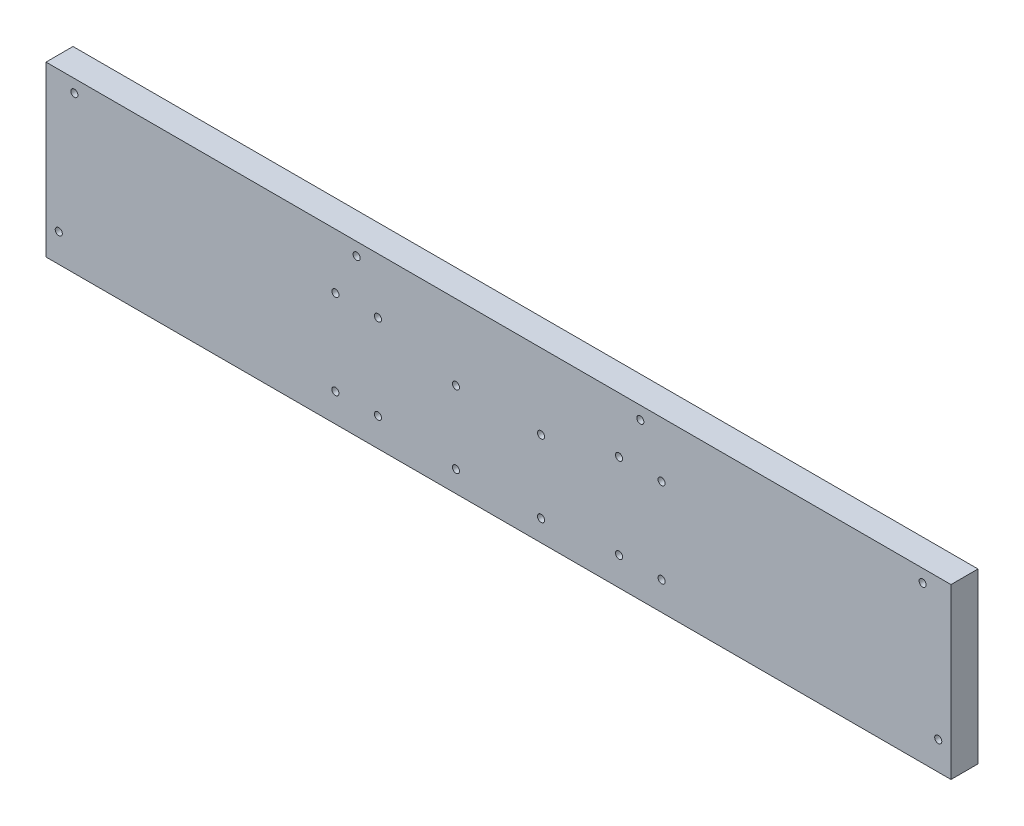
ISO-10303-21;
HEADER;
FILE_DESCRIPTION(('STEP AP214'),'2;1');
FILE_NAME('part.step','',(''),(''),'','','');
FILE_SCHEMA(('AUTOMOTIVE_DESIGN { 1 0 10303 214 1 1 1 1 }'));
ENDSEC;
DATA;
#1=APPLICATION_CONTEXT('core data for automotive mechanical design processes');
#2=APPLICATION_PROTOCOL_DEFINITION('international standard','automotive_design',2000,#1);
#3=PRODUCT_CONTEXT('',#1,'mechanical');
#4=PRODUCT('Part','Part','',(#3));
#5=PRODUCT_RELATED_PRODUCT_CATEGORY('part','',(#4));
#6=PRODUCT_DEFINITION_FORMATION('','',#4);
#7=PRODUCT_DEFINITION_CONTEXT('part definition',#1,'design');
#8=PRODUCT_DEFINITION('design','',#6,#7);
#9=PRODUCT_DEFINITION_SHAPE('','',#8);
#10=(LENGTH_UNIT() NAMED_UNIT(*) SI_UNIT(.MILLI.,.METRE.));
#11=(NAMED_UNIT(*) PLANE_ANGLE_UNIT() SI_UNIT($,.RADIAN.));
#12=(NAMED_UNIT(*) SI_UNIT($,.STERADIAN.) SOLID_ANGLE_UNIT());
#13=UNCERTAINTY_MEASURE_WITH_UNIT(LENGTH_MEASURE(1.E-05),#10,'distance_accuracy_value','');
#14=(GEOMETRIC_REPRESENTATION_CONTEXT(3) GLOBAL_UNCERTAINTY_ASSIGNED_CONTEXT((#13)) GLOBAL_UNIT_ASSIGNED_CONTEXT((#10,
#11,#12)) REPRESENTATION_CONTEXT('',''));
#15=CARTESIAN_POINT('',(0.,0.,0.));
#16=DIRECTION('',(0.,0.,1.));
#17=DIRECTION('',(1.,0.,0.));
#18=AXIS2_PLACEMENT_3D('',#15,#16,#17);
#19=CARTESIAN_POINT('',(0.,119.05,19.05));
#20=DIRECTION('',(-1.,0.,0.));
#21=DIRECTION('',(0.,0.,1.));
#22=AXIS2_PLACEMENT_3D('',#19,#20,#21);
#23=PLANE('',#22);
#24=DIRECTION('',(0.,1.,0.));
#25=VECTOR('',#24,1.);
#26=CARTESIAN_POINT('',(0.,119.05,0.));
#27=LINE('',#26,#25);
#28=CARTESIAN_POINT('',(0.,0.,0.));
#29=VERTEX_POINT('',#28);
#30=CARTESIAN_POINT('',(0.,119.05,0.));
#31=VERTEX_POINT('',#30);
#32=EDGE_CURVE('E98',#29,#31,#27,.T.);
#33=ORIENTED_EDGE('',*,*,#32,.T.);
#34=DIRECTION('',(0.,0.,-1.));
#35=VECTOR('',#34,1.);
#36=CARTESIAN_POINT('',(0.,119.05,19.05));
#37=LINE('',#36,#35);
#38=CARTESIAN_POINT('',(0.,119.05,19.05));
#39=VERTEX_POINT('',#38);
#40=EDGE_CURVE('E11',#39,#31,#37,.T.);
#41=ORIENTED_EDGE('',*,*,#40,.F.);
#42=DIRECTION('',(0.,1.,0.));
#43=VECTOR('',#42,1.);
#44=CARTESIAN_POINT('',(0.,119.05,19.05));
#45=LINE('',#44,#43);
#46=CARTESIAN_POINT('',(0.,0.,19.05));
#47=VERTEX_POINT('',#46);
#48=EDGE_CURVE('E85',#47,#39,#45,.T.);
#49=ORIENTED_EDGE('',*,*,#48,.F.);
#50=DIRECTION('',(0.,0.,-1.));
#51=VECTOR('',#50,1.);
#52=CARTESIAN_POINT('',(0.,0.,19.05));
#53=LINE('',#52,#51);
#54=EDGE_CURVE('E94',#47,#29,#53,.T.);
#55=ORIENTED_EDGE('',*,*,#54,.T.);
#56=EDGE_LOOP('',(#33,#41,#49,#55));
#57=FACE_BOUND('',#56,.T.);
#58=ADVANCED_FACE('F32',(#57),#23,.F.);
#59=CARTESIAN_POINT('',(0.,119.05,19.05));
#60=DIRECTION('',(0.,-1.,0.));
#61=DIRECTION('',(0.,0.,-1.));
#62=AXIS2_PLACEMENT_3D('',#59,#60,#61);
#63=PLANE('',#62);
#64=DIRECTION('',(-1.,0.,0.));
#65=VECTOR('',#64,1.);
#66=CARTESIAN_POINT('',(0.,119.05,0.));
#67=LINE('',#66,#65);
#68=CARTESIAN_POINT('',(-638.1,119.05,0.));
#69=VERTEX_POINT('',#68);
#70=EDGE_CURVE('E89',#31,#69,#67,.T.);
#71=ORIENTED_EDGE('',*,*,#70,.T.);
#72=DIRECTION('',(0.,0.,-1.));
#73=VECTOR('',#72,1.);
#74=CARTESIAN_POINT('',(-638.1,119.05,19.05));
#75=LINE('',#74,#73);
#76=CARTESIAN_POINT('',(-638.1,119.05,19.05));
#77=VERTEX_POINT('',#76);
#78=EDGE_CURVE('E41',#77,#69,#75,.T.);
#79=ORIENTED_EDGE('',*,*,#78,.F.);
#80=DIRECTION('',(-1.,0.,0.));
#81=VECTOR('',#80,1.);
#82=CARTESIAN_POINT('',(0.,119.05,19.05));
#83=LINE('',#82,#81);
#84=EDGE_CURVE('E80',#39,#77,#83,.T.);
#85=ORIENTED_EDGE('',*,*,#84,.F.);
#86=ORIENTED_EDGE('',*,*,#40,.T.);
#87=EDGE_LOOP('',(#71,#79,#85,#86));
#88=FACE_BOUND('',#87,.T.);
#89=ADVANCED_FACE('F88',(#88),#63,.F.);
#90=CARTESIAN_POINT('',(-638.1,119.05,19.05));
#91=DIRECTION('',(1.,0.,0.));
#92=DIRECTION('',(0.,0.,-1.));
#93=AXIS2_PLACEMENT_3D('',#90,#91,#92);
#94=PLANE('',#93);
#95=DIRECTION('',(0.,-1.,0.));
#96=VECTOR('',#95,1.);
#97=CARTESIAN_POINT('',(-638.1,119.05,0.));
#98=LINE('',#97,#96);
#99=CARTESIAN_POINT('',(-638.1,0.,0.));
#100=VERTEX_POINT('',#99);
#101=EDGE_CURVE('E67',#69,#100,#98,.T.);
#102=ORIENTED_EDGE('',*,*,#101,.T.);
#103=DIRECTION('',(0.,0.,-1.));
#104=VECTOR('',#103,1.);
#105=CARTESIAN_POINT('',(-638.1,0.,19.05));
#106=LINE('',#105,#104);
#107=CARTESIAN_POINT('',(-638.1,0.,19.05));
#108=VERTEX_POINT('',#107);
#109=EDGE_CURVE('E90',#108,#100,#106,.T.);
#110=ORIENTED_EDGE('',*,*,#109,.F.);
#111=DIRECTION('',(0.,-1.,0.));
#112=VECTOR('',#111,1.);
#113=CARTESIAN_POINT('',(-638.1,119.05,19.05));
#114=LINE('',#113,#112);
#115=EDGE_CURVE('E83',#77,#108,#114,.T.);
#116=ORIENTED_EDGE('',*,*,#115,.F.);
#117=ORIENTED_EDGE('',*,*,#78,.T.);
#118=EDGE_LOOP('',(#102,#110,#116,#117));
#119=FACE_BOUND('',#118,.T.);
#120=ADVANCED_FACE('F92',(#119),#94,.F.);
#121=CARTESIAN_POINT('',(0.,0.,19.05));
#122=DIRECTION('',(0.,1.,0.));
#123=DIRECTION('',(0.,0.,1.));
#124=AXIS2_PLACEMENT_3D('',#121,#122,#123);
#125=PLANE('',#124);
#126=DIRECTION('',(1.,0.,0.));
#127=VECTOR('',#126,1.);
#128=CARTESIAN_POINT('',(0.,0.,0.));
#129=LINE('',#128,#127);
#130=EDGE_CURVE('E73',#100,#29,#129,.T.);
#131=ORIENTED_EDGE('',*,*,#130,.T.);
#132=ORIENTED_EDGE('',*,*,#54,.F.);
#133=DIRECTION('',(1.,0.,0.));
#134=VECTOR('',#133,1.);
#135=CARTESIAN_POINT('',(0.,0.,19.05));
#136=LINE('',#135,#134);
#137=EDGE_CURVE('E50',#108,#47,#136,.T.);
#138=ORIENTED_EDGE('',*,*,#137,.F.);
#139=ORIENTED_EDGE('',*,*,#109,.T.);
#140=EDGE_LOOP('',(#131,#132,#138,#139));
#141=FACE_BOUND('',#140,.T.);
#142=ADVANCED_FACE('F188',(#141),#125,.F.);
#143=CARTESIAN_POINT('',(0.,0.,19.05));
#144=DIRECTION('',(0.,0.,-1.));
#145=DIRECTION('',(-1.,0.,0.));
#146=AXIS2_PLACEMENT_3D('',#143,#144,#145);
#147=PLANE('',#146);
#148=CARTESIAN_POINT('',(-434.05,20.,19.05));
#149=DIRECTION('',(0.,0.,-1.));
#150=DIRECTION('',(-1.,0.,0.));
#151=AXIS2_PLACEMENT_3D('',#148,#149,#150);
#152=CIRCLE('',#151,2.5);
#153=CARTESIAN_POINT('',(-436.55,20.,19.05));
#154=VERTEX_POINT('',#153);
#155=EDGE_CURVE('E400',#154,#154,#152,.T.);
#156=ORIENTED_EDGE('',*,*,#155,.T.);
#157=EDGE_LOOP('',(#156));
#158=FACE_BOUND('',#157,.T.);
#159=CARTESIAN_POINT('',(-404.05,20.,19.05));
#160=DIRECTION('',(0.,0.,-1.));
#161=DIRECTION('',(-1.,0.,0.));
#162=AXIS2_PLACEMENT_3D('',#159,#160,#161);
#163=CIRCLE('',#162,2.5);
#164=CARTESIAN_POINT('',(-406.55,20.,19.05));
#165=VERTEX_POINT('',#164);
#166=EDGE_CURVE('E404',#165,#165,#163,.T.);
#167=ORIENTED_EDGE('',*,*,#166,.T.);
#168=EDGE_LOOP('',(#167));
#169=FACE_BOUND('',#168,.T.);
#170=CARTESIAN_POINT('',(-404.05,80.,19.05));
#171=DIRECTION('',(0.,0.,-1.));
#172=DIRECTION('',(-1.,0.,0.));
#173=AXIS2_PLACEMENT_3D('',#170,#171,#172);
#174=CIRCLE('',#173,2.5);
#175=CARTESIAN_POINT('',(-406.55,80.,19.05));
#176=VERTEX_POINT('',#175);
#177=EDGE_CURVE('E413',#176,#176,#174,.T.);
#178=ORIENTED_EDGE('',*,*,#177,.T.);
#179=EDGE_LOOP('',(#178));
#180=FACE_BOUND('',#179,.T.);
#181=CARTESIAN_POINT('',(-434.05,80.,19.05));
#182=DIRECTION('',(0.,0.,-1.));
#183=DIRECTION('',(-1.,0.,0.));
#184=AXIS2_PLACEMENT_3D('',#181,#182,#183);
#185=CIRCLE('',#184,2.5);
#186=CARTESIAN_POINT('',(-436.55,80.,19.05));
#187=VERTEX_POINT('',#186);
#188=EDGE_CURVE('E35',#187,#187,#185,.T.);
#189=ORIENTED_EDGE('',*,*,#188,.T.);
#190=EDGE_LOOP('',(#189));
#191=FACE_BOUND('',#190,.T.);
#192=CARTESIAN_POINT('',(-349.05,15.,19.05));
#193=DIRECTION('',(0.,0.,-1.));
#194=DIRECTION('',(-1.,0.,0.));
#195=AXIS2_PLACEMENT_3D('',#192,#193,#194);
#196=CIRCLE('',#195,2.5);
#197=CARTESIAN_POINT('',(-351.55,15.,19.05));
#198=VERTEX_POINT('',#197);
#199=EDGE_CURVE('E422',#198,#198,#196,.T.);
#200=ORIENTED_EDGE('',*,*,#199,.T.);
#201=EDGE_LOOP('',(#200));
#202=FACE_BOUND('',#201,.T.);
#203=CARTESIAN_POINT('',(-349.05,66.,19.05));
#204=DIRECTION('',(0.,0.,-1.));
#205=DIRECTION('',(-1.,0.,0.));
#206=AXIS2_PLACEMENT_3D('',#203,#204,#205);
#207=CIRCLE('',#206,2.5);
#208=CARTESIAN_POINT('',(-351.55,66.,19.05));
#209=VERTEX_POINT('',#208);
#210=EDGE_CURVE('E428',#209,#209,#207,.T.);
#211=ORIENTED_EDGE('',*,*,#210,.T.);
#212=EDGE_LOOP('',(#211));
#213=FACE_BOUND('',#212,.T.);
#214=CARTESIAN_POINT('',(-289.05,66.,19.05));
#215=DIRECTION('',(0.,0.,-1.));
#216=DIRECTION('',(-1.,0.,0.));
#217=AXIS2_PLACEMENT_3D('',#214,#215,#216);
#218=CIRCLE('',#217,2.5);
#219=CARTESIAN_POINT('',(-291.55,66.,19.05));
#220=VERTEX_POINT('',#219);
#221=EDGE_CURVE('E434',#220,#220,#218,.T.);
#222=ORIENTED_EDGE('',*,*,#221,.T.);
#223=EDGE_LOOP('',(#222));
#224=FACE_BOUND('',#223,.T.);
#225=CARTESIAN_POINT('',(-289.05,15.,19.05));
#226=DIRECTION('',(0.,0.,-1.));
#227=DIRECTION('',(-1.,0.,0.));
#228=AXIS2_PLACEMENT_3D('',#225,#226,#227);
#229=CIRCLE('',#228,2.5);
#230=CARTESIAN_POINT('',(-291.55,15.,19.05));
#231=VERTEX_POINT('',#230);
#232=EDGE_CURVE('E440',#231,#231,#229,.T.);
#233=ORIENTED_EDGE('',*,*,#232,.T.);
#234=EDGE_LOOP('',(#233));
#235=FACE_BOUND('',#234,.T.);
#236=CARTESIAN_POINT('',(-234.05,20.,19.05));
#237=DIRECTION('',(0.,0.,-1.));
#238=DIRECTION('',(-1.,0.,0.));
#239=AXIS2_PLACEMENT_3D('',#236,#237,#238);
#240=CIRCLE('',#239,2.5);
#241=CARTESIAN_POINT('',(-236.55,20.,19.05));
#242=VERTEX_POINT('',#241);
#243=EDGE_CURVE('E446',#242,#242,#240,.T.);
#244=ORIENTED_EDGE('',*,*,#243,.T.);
#245=EDGE_LOOP('',(#244));
#246=FACE_BOUND('',#245,.T.);
#247=CARTESIAN_POINT('',(-234.05,80.,19.05));
#248=DIRECTION('',(0.,0.,-1.));
#249=DIRECTION('',(-1.,0.,0.));
#250=AXIS2_PLACEMENT_3D('',#247,#248,#249);
#251=CIRCLE('',#250,2.5);
#252=CARTESIAN_POINT('',(-236.55,80.,19.05));
#253=VERTEX_POINT('',#252);
#254=EDGE_CURVE('E119',#253,#253,#251,.T.);
#255=ORIENTED_EDGE('',*,*,#254,.T.);
#256=EDGE_LOOP('',(#255));
#257=FACE_BOUND('',#256,.T.);
#258=CARTESIAN_POINT('',(-204.05,80.,19.05));
#259=DIRECTION('',(0.,0.,-1.));
#260=DIRECTION('',(-1.,0.,0.));
#261=AXIS2_PLACEMENT_3D('',#258,#259,#260);
#262=CIRCLE('',#261,2.5);
#263=CARTESIAN_POINT('',(-206.55,80.,19.05));
#264=VERTEX_POINT('',#263);
#265=EDGE_CURVE('E111',#264,#264,#262,.T.);
#266=ORIENTED_EDGE('',*,*,#265,.T.);
#267=EDGE_LOOP('',(#266));
#268=FACE_BOUND('',#267,.T.);
#269=CARTESIAN_POINT('',(-204.05,20.,19.05));
#270=DIRECTION('',(0.,0.,-1.));
#271=DIRECTION('',(-1.,0.,0.));
#272=AXIS2_PLACEMENT_3D('',#269,#270,#271);
#273=CIRCLE('',#272,2.5);
#274=CARTESIAN_POINT('',(-206.55,20.,19.05));
#275=VERTEX_POINT('',#274);
#276=EDGE_CURVE('E107',#275,#275,#273,.T.);
#277=ORIENTED_EDGE('',*,*,#276,.T.);
#278=EDGE_LOOP('',(#277));
#279=FACE_BOUND('',#278,.T.);
#280=CARTESIAN_POINT('',(-629.1,20.,19.05));
#281=DIRECTION('',(0.,0.,-1.));
#282=DIRECTION('',(-1.,0.,0.));
#283=AXIS2_PLACEMENT_3D('',#280,#281,#282);
#284=CIRCLE('',#283,2.49999999999995);
#285=CARTESIAN_POINT('',(-631.6,20.,19.05));
#286=VERTEX_POINT('',#285);
#287=EDGE_CURVE('E130',#286,#286,#284,.T.);
#288=ORIENTED_EDGE('',*,*,#287,.T.);
#289=EDGE_LOOP('',(#288));
#290=FACE_BOUND('',#289,.T.);
#291=CARTESIAN_POINT('',(-618.1,110.05,19.05));
#292=DIRECTION('',(0.,0.,-1.));
#293=DIRECTION('',(-1.,0.,0.));
#294=AXIS2_PLACEMENT_3D('',#291,#292,#293);
#295=CIRCLE('',#294,2.49999999999995);
#296=CARTESIAN_POINT('',(-620.6,110.05,19.05));
#297=VERTEX_POINT('',#296);
#298=EDGE_CURVE('E136',#297,#297,#295,.T.);
#299=ORIENTED_EDGE('',*,*,#298,.T.);
#300=EDGE_LOOP('',(#299));
#301=FACE_BOUND('',#300,.T.);
#302=CARTESIAN_POINT('',(-419.05,110.05,19.05));
#303=DIRECTION('',(0.,0.,-1.));
#304=DIRECTION('',(-1.,0.,0.));
#305=AXIS2_PLACEMENT_3D('',#302,#303,#304);
#306=CIRCLE('',#305,2.5);
#307=CARTESIAN_POINT('',(-421.55,110.05,19.05));
#308=VERTEX_POINT('',#307);
#309=EDGE_CURVE('E142',#308,#308,#306,.T.);
#310=ORIENTED_EDGE('',*,*,#309,.T.);
#311=EDGE_LOOP('',(#310));
#312=FACE_BOUND('',#311,.T.);
#313=CARTESIAN_POINT('',(-219.05,110.05,19.05));
#314=DIRECTION('',(0.,0.,-1.));
#315=DIRECTION('',(-1.,0.,0.));
#316=AXIS2_PLACEMENT_3D('',#313,#314,#315);
#317=CIRCLE('',#316,2.5);
#318=CARTESIAN_POINT('',(-221.55,110.05,19.05));
#319=VERTEX_POINT('',#318);
#320=EDGE_CURVE('E148',#319,#319,#317,.T.);
#321=ORIENTED_EDGE('',*,*,#320,.T.);
#322=EDGE_LOOP('',(#321));
#323=FACE_BOUND('',#322,.T.);
#324=CARTESIAN_POINT('',(-20.,110.05,19.05));
#325=DIRECTION('',(0.,0.,-1.));
#326=DIRECTION('',(-1.,0.,0.));
#327=AXIS2_PLACEMENT_3D('',#324,#325,#326);
#328=CIRCLE('',#327,2.49999999999999);
#329=CARTESIAN_POINT('',(-22.5,110.05,19.05));
#330=VERTEX_POINT('',#329);
#331=EDGE_CURVE('E154',#330,#330,#328,.T.);
#332=ORIENTED_EDGE('',*,*,#331,.T.);
#333=EDGE_LOOP('',(#332));
#334=FACE_BOUND('',#333,.T.);
#335=CARTESIAN_POINT('',(-9.00000000000001,20.,19.05));
#336=DIRECTION('',(0.,0.,-1.));
#337=DIRECTION('',(-1.,0.,0.));
#338=AXIS2_PLACEMENT_3D('',#335,#336,#337);
#339=CIRCLE('',#338,2.5);
#340=CARTESIAN_POINT('',(-11.5,20.,19.05));
#341=VERTEX_POINT('',#340);
#342=EDGE_CURVE('E101',#341,#341,#339,.T.);
#343=ORIENTED_EDGE('',*,*,#342,.T.);
#344=EDGE_LOOP('',(#343));
#345=FACE_BOUND('',#344,.T.);
#346=ORIENTED_EDGE('',*,*,#48,.T.);
#347=ORIENTED_EDGE('',*,*,#84,.T.);
#348=ORIENTED_EDGE('',*,*,#115,.T.);
#349=ORIENTED_EDGE('',*,*,#137,.T.);
#350=EDGE_LOOP('',(#346,#347,#348,#349));
#351=FACE_BOUND('',#350,.T.);
#352=ADVANCED_FACE('F81',(#158,#169,#180,#191,#202,#213,#224,#235,#246,#257,#268,#279,#290,#301,
#312,#323,#334,#345,#351),#147,.F.);
#353=CARTESIAN_POINT('',(0.,0.,0.));
#354=DIRECTION('',(0.,0.,-1.));
#355=DIRECTION('',(-1.,0.,0.));
#356=AXIS2_PLACEMENT_3D('',#353,#354,#355);
#357=PLANE('',#356);
#358=CARTESIAN_POINT('',(-434.05,20.,0.));
#359=DIRECTION('',(0.,0.,-1.));
#360=DIRECTION('',(-1.,0.,0.));
#361=AXIS2_PLACEMENT_3D('',#358,#359,#360);
#362=CIRCLE('',#361,2.5);
#363=CARTESIAN_POINT('',(-436.55,20.,0.));
#364=VERTEX_POINT('',#363);
#365=EDGE_CURVE('E397',#364,#364,#362,.T.);
#366=ORIENTED_EDGE('',*,*,#365,.F.);
#367=EDGE_LOOP('',(#366));
#368=FACE_BOUND('',#367,.T.);
#369=CARTESIAN_POINT('',(-404.05,20.,0.));
#370=DIRECTION('',(0.,0.,-1.));
#371=DIRECTION('',(-1.,0.,0.));
#372=AXIS2_PLACEMENT_3D('',#369,#370,#371);
#373=CIRCLE('',#372,2.5);
#374=CARTESIAN_POINT('',(-406.55,20.,0.));
#375=VERTEX_POINT('',#374);
#376=EDGE_CURVE('E401',#375,#375,#373,.T.);
#377=ORIENTED_EDGE('',*,*,#376,.F.);
#378=EDGE_LOOP('',(#377));
#379=FACE_BOUND('',#378,.T.);
#380=CARTESIAN_POINT('',(-404.05,80.,0.));
#381=DIRECTION('',(0.,0.,-1.));
#382=DIRECTION('',(-1.,0.,0.));
#383=AXIS2_PLACEMENT_3D('',#380,#381,#382);
#384=CIRCLE('',#383,2.5);
#385=CARTESIAN_POINT('',(-406.55,80.,0.));
#386=VERTEX_POINT('',#385);
#387=EDGE_CURVE('E410',#386,#386,#384,.T.);
#388=ORIENTED_EDGE('',*,*,#387,.F.);
#389=EDGE_LOOP('',(#388));
#390=FACE_BOUND('',#389,.T.);
#391=CARTESIAN_POINT('',(-434.05,80.,0.));
#392=DIRECTION('',(0.,0.,-1.));
#393=DIRECTION('',(-1.,0.,0.));
#394=AXIS2_PLACEMENT_3D('',#391,#392,#393);
#395=CIRCLE('',#394,2.5);
#396=CARTESIAN_POINT('',(-436.55,80.,0.));
#397=VERTEX_POINT('',#396);
#398=EDGE_CURVE('E416',#397,#397,#395,.T.);
#399=ORIENTED_EDGE('',*,*,#398,.F.);
#400=EDGE_LOOP('',(#399));
#401=FACE_BOUND('',#400,.T.);
#402=CARTESIAN_POINT('',(-349.05,15.,0.));
#403=DIRECTION('',(0.,0.,-1.));
#404=DIRECTION('',(-1.,0.,0.));
#405=AXIS2_PLACEMENT_3D('',#402,#403,#404);
#406=CIRCLE('',#405,2.5);
#407=CARTESIAN_POINT('',(-351.55,15.,0.));
#408=VERTEX_POINT('',#407);
#409=EDGE_CURVE('E419',#408,#408,#406,.T.);
#410=ORIENTED_EDGE('',*,*,#409,.F.);
#411=EDGE_LOOP('',(#410));
#412=FACE_BOUND('',#411,.T.);
#413=CARTESIAN_POINT('',(-349.05,66.,0.));
#414=DIRECTION('',(0.,0.,-1.));
#415=DIRECTION('',(-1.,0.,0.));
#416=AXIS2_PLACEMENT_3D('',#413,#414,#415);
#417=CIRCLE('',#416,2.5);
#418=CARTESIAN_POINT('',(-351.55,66.,0.));
#419=VERTEX_POINT('',#418);
#420=EDGE_CURVE('E425',#419,#419,#417,.T.);
#421=ORIENTED_EDGE('',*,*,#420,.F.);
#422=EDGE_LOOP('',(#421));
#423=FACE_BOUND('',#422,.T.);
#424=CARTESIAN_POINT('',(-289.05,66.,0.));
#425=DIRECTION('',(0.,0.,-1.));
#426=DIRECTION('',(-1.,0.,0.));
#427=AXIS2_PLACEMENT_3D('',#424,#425,#426);
#428=CIRCLE('',#427,2.5);
#429=CARTESIAN_POINT('',(-291.55,66.,0.));
#430=VERTEX_POINT('',#429);
#431=EDGE_CURVE('E431',#430,#430,#428,.T.);
#432=ORIENTED_EDGE('',*,*,#431,.F.);
#433=EDGE_LOOP('',(#432));
#434=FACE_BOUND('',#433,.T.);
#435=CARTESIAN_POINT('',(-289.05,15.,0.));
#436=DIRECTION('',(0.,0.,-1.));
#437=DIRECTION('',(-1.,0.,0.));
#438=AXIS2_PLACEMENT_3D('',#435,#436,#437);
#439=CIRCLE('',#438,2.5);
#440=CARTESIAN_POINT('',(-291.55,15.,0.));
#441=VERTEX_POINT('',#440);
#442=EDGE_CURVE('E437',#441,#441,#439,.T.);
#443=ORIENTED_EDGE('',*,*,#442,.F.);
#444=EDGE_LOOP('',(#443));
#445=FACE_BOUND('',#444,.T.);
#446=CARTESIAN_POINT('',(-234.05,20.,0.));
#447=DIRECTION('',(0.,0.,-1.));
#448=DIRECTION('',(-1.,0.,0.));
#449=AXIS2_PLACEMENT_3D('',#446,#447,#448);
#450=CIRCLE('',#449,2.5);
#451=CARTESIAN_POINT('',(-236.55,20.,0.));
#452=VERTEX_POINT('',#451);
#453=EDGE_CURVE('E443',#452,#452,#450,.T.);
#454=ORIENTED_EDGE('',*,*,#453,.F.);
#455=EDGE_LOOP('',(#454));
#456=FACE_BOUND('',#455,.T.);
#457=CARTESIAN_POINT('',(-234.05,80.,0.));
#458=DIRECTION('',(0.,0.,-1.));
#459=DIRECTION('',(-1.,0.,0.));
#460=AXIS2_PLACEMENT_3D('',#457,#458,#459);
#461=CIRCLE('',#460,2.5);
#462=CARTESIAN_POINT('',(-236.55,80.,0.));
#463=VERTEX_POINT('',#462);
#464=EDGE_CURVE('E124',#463,#463,#461,.T.);
#465=ORIENTED_EDGE('',*,*,#464,.F.);
#466=EDGE_LOOP('',(#465));
#467=FACE_BOUND('',#466,.T.);
#468=CARTESIAN_POINT('',(-204.05,80.,0.));
#469=DIRECTION('',(0.,0.,-1.));
#470=DIRECTION('',(-1.,0.,0.));
#471=AXIS2_PLACEMENT_3D('',#468,#469,#470);
#472=CIRCLE('',#471,2.5);
#473=CARTESIAN_POINT('',(-206.55,80.,0.));
#474=VERTEX_POINT('',#473);
#475=EDGE_CURVE('E113',#474,#474,#472,.T.);
#476=ORIENTED_EDGE('',*,*,#475,.F.);
#477=EDGE_LOOP('',(#476));
#478=FACE_BOUND('',#477,.T.);
#479=CARTESIAN_POINT('',(-204.05,20.,0.));
#480=DIRECTION('',(0.,0.,-1.));
#481=DIRECTION('',(-1.,0.,0.));
#482=AXIS2_PLACEMENT_3D('',#479,#480,#481);
#483=CIRCLE('',#482,2.5);
#484=CARTESIAN_POINT('',(-206.55,20.,0.));
#485=VERTEX_POINT('',#484);
#486=EDGE_CURVE('E110',#485,#485,#483,.T.);
#487=ORIENTED_EDGE('',*,*,#486,.F.);
#488=EDGE_LOOP('',(#487));
#489=FACE_BOUND('',#488,.T.);
#490=CARTESIAN_POINT('',(-629.1,20.,0.));
#491=DIRECTION('',(0.,0.,-1.));
#492=DIRECTION('',(-1.,0.,0.));
#493=AXIS2_PLACEMENT_3D('',#490,#491,#492);
#494=CIRCLE('',#493,2.49999999999995);
#495=CARTESIAN_POINT('',(-631.6,20.,0.));
#496=VERTEX_POINT('',#495);
#497=EDGE_CURVE('E109',#496,#496,#494,.T.);
#498=ORIENTED_EDGE('',*,*,#497,.F.);
#499=EDGE_LOOP('',(#498));
#500=FACE_BOUND('',#499,.T.);
#501=CARTESIAN_POINT('',(-618.1,110.05,0.));
#502=DIRECTION('',(0.,0.,-1.));
#503=DIRECTION('',(-1.,0.,0.));
#504=AXIS2_PLACEMENT_3D('',#501,#502,#503);
#505=CIRCLE('',#504,2.49999999999995);
#506=CARTESIAN_POINT('',(-620.6,110.05,0.));
#507=VERTEX_POINT('',#506);
#508=EDGE_CURVE('E133',#507,#507,#505,.T.);
#509=ORIENTED_EDGE('',*,*,#508,.F.);
#510=EDGE_LOOP('',(#509));
#511=FACE_BOUND('',#510,.T.);
#512=CARTESIAN_POINT('',(-419.05,110.05,0.));
#513=DIRECTION('',(0.,0.,-1.));
#514=DIRECTION('',(-1.,0.,0.));
#515=AXIS2_PLACEMENT_3D('',#512,#513,#514);
#516=CIRCLE('',#515,2.5);
#517=CARTESIAN_POINT('',(-421.55,110.05,0.));
#518=VERTEX_POINT('',#517);
#519=EDGE_CURVE('E139',#518,#518,#516,.T.);
#520=ORIENTED_EDGE('',*,*,#519,.F.);
#521=EDGE_LOOP('',(#520));
#522=FACE_BOUND('',#521,.T.);
#523=CARTESIAN_POINT('',(-219.05,110.05,0.));
#524=DIRECTION('',(0.,0.,-1.));
#525=DIRECTION('',(-1.,0.,0.));
#526=AXIS2_PLACEMENT_3D('',#523,#524,#525);
#527=CIRCLE('',#526,2.5);
#528=CARTESIAN_POINT('',(-221.55,110.05,0.));
#529=VERTEX_POINT('',#528);
#530=EDGE_CURVE('E145',#529,#529,#527,.T.);
#531=ORIENTED_EDGE('',*,*,#530,.F.);
#532=EDGE_LOOP('',(#531));
#533=FACE_BOUND('',#532,.T.);
#534=CARTESIAN_POINT('',(-20.,110.05,0.));
#535=DIRECTION('',(0.,0.,-1.));
#536=DIRECTION('',(-1.,0.,0.));
#537=AXIS2_PLACEMENT_3D('',#534,#535,#536);
#538=CIRCLE('',#537,2.5);
#539=CARTESIAN_POINT('',(-22.5,110.05,0.));
#540=VERTEX_POINT('',#539);
#541=EDGE_CURVE('E151',#540,#540,#538,.T.);
#542=ORIENTED_EDGE('',*,*,#541,.F.);
#543=EDGE_LOOP('',(#542));
#544=FACE_BOUND('',#543,.T.);
#545=CARTESIAN_POINT('',(-9.00000000000001,20.,0.));
#546=DIRECTION('',(0.,0.,-1.));
#547=DIRECTION('',(-1.,0.,0.));
#548=AXIS2_PLACEMENT_3D('',#545,#546,#547);
#549=CIRCLE('',#548,2.5);
#550=CARTESIAN_POINT('',(-11.5,20.,0.));
#551=VERTEX_POINT('',#550);
#552=EDGE_CURVE('E157',#551,#551,#549,.T.);
#553=ORIENTED_EDGE('',*,*,#552,.F.);
#554=EDGE_LOOP('',(#553));
#555=FACE_BOUND('',#554,.T.);
#556=ORIENTED_EDGE('',*,*,#32,.F.);
#557=ORIENTED_EDGE('',*,*,#130,.F.);
#558=ORIENTED_EDGE('',*,*,#101,.F.);
#559=ORIENTED_EDGE('',*,*,#70,.F.);
#560=EDGE_LOOP('',(#556,#557,#558,#559));
#561=FACE_BOUND('',#560,.T.);
#562=ADVANCED_FACE('F167',(#368,#379,#390,#401,#412,#423,#434,#445,#456,#467,#478,#489,#500,
#511,#522,#533,#544,#555,#561),#357,.T.);
#563=CARTESIAN_POINT('',(-9.00000000000001,20.,0.));
#564=DIRECTION('',(0.,0.,-1.));
#565=DIRECTION('',(-1.,0.,0.));
#566=AXIS2_PLACEMENT_3D('',#563,#564,#565);
#567=CYLINDRICAL_SURFACE('',#566,2.5);
#568=ORIENTED_EDGE('',*,*,#552,.T.);
#569=EDGE_LOOP('',(#568));
#570=FACE_BOUND('',#569,.T.);
#571=ORIENTED_EDGE('',*,*,#342,.F.);
#572=EDGE_LOOP('',(#571));
#573=FACE_BOUND('',#572,.T.);
#574=ADVANCED_FACE('F164',(#570,#573),#567,.F.);
#575=CARTESIAN_POINT('',(-20.,110.05,0.));
#576=DIRECTION('',(0.,0.,-1.));
#577=DIRECTION('',(-1.,0.,0.));
#578=AXIS2_PLACEMENT_3D('',#575,#576,#577);
#579=CYLINDRICAL_SURFACE('',#578,2.49999999999999);
#580=ORIENTED_EDGE('',*,*,#541,.T.);
#581=EDGE_LOOP('',(#580));
#582=FACE_BOUND('',#581,.T.);
#583=ORIENTED_EDGE('',*,*,#331,.F.);
#584=EDGE_LOOP('',(#583));
#585=FACE_BOUND('',#584,.T.);
#586=ADVANCED_FACE('F166',(#582,#585),#579,.F.);
#587=CARTESIAN_POINT('',(-219.05,110.05,0.));
#588=DIRECTION('',(0.,0.,-1.));
#589=DIRECTION('',(-1.,0.,0.));
#590=AXIS2_PLACEMENT_3D('',#587,#588,#589);
#591=CYLINDRICAL_SURFACE('',#590,2.5);
#592=ORIENTED_EDGE('',*,*,#530,.T.);
#593=EDGE_LOOP('',(#592));
#594=FACE_BOUND('',#593,.T.);
#595=ORIENTED_EDGE('',*,*,#320,.F.);
#596=EDGE_LOOP('',(#595));
#597=FACE_BOUND('',#596,.T.);
#598=ADVANCED_FACE('F174',(#594,#597),#591,.F.);
#599=CARTESIAN_POINT('',(-419.05,110.05,0.));
#600=DIRECTION('',(0.,0.,-1.));
#601=DIRECTION('',(-1.,0.,0.));
#602=AXIS2_PLACEMENT_3D('',#599,#600,#601);
#603=CYLINDRICAL_SURFACE('',#602,2.5);
#604=ORIENTED_EDGE('',*,*,#519,.T.);
#605=EDGE_LOOP('',(#604));
#606=FACE_BOUND('',#605,.T.);
#607=ORIENTED_EDGE('',*,*,#309,.F.);
#608=EDGE_LOOP('',(#607));
#609=FACE_BOUND('',#608,.T.);
#610=ADVANCED_FACE('F241',(#606,#609),#603,.F.);
#611=CARTESIAN_POINT('',(-618.1,110.05,0.));
#612=DIRECTION('',(0.,0.,-1.));
#613=DIRECTION('',(-1.,0.,0.));
#614=AXIS2_PLACEMENT_3D('',#611,#612,#613);
#615=CYLINDRICAL_SURFACE('',#614,2.49999999999995);
#616=ORIENTED_EDGE('',*,*,#508,.T.);
#617=EDGE_LOOP('',(#616));
#618=FACE_BOUND('',#617,.T.);
#619=ORIENTED_EDGE('',*,*,#298,.F.);
#620=EDGE_LOOP('',(#619));
#621=FACE_BOUND('',#620,.T.);
#622=ADVANCED_FACE('F250',(#618,#621),#615,.F.);
#623=CARTESIAN_POINT('',(-629.1,20.,0.));
#624=DIRECTION('',(0.,0.,-1.));
#625=DIRECTION('',(-1.,0.,0.));
#626=AXIS2_PLACEMENT_3D('',#623,#624,#625);
#627=CYLINDRICAL_SURFACE('',#626,2.49999999999995);
#628=ORIENTED_EDGE('',*,*,#497,.T.);
#629=EDGE_LOOP('',(#628));
#630=FACE_BOUND('',#629,.T.);
#631=ORIENTED_EDGE('',*,*,#287,.F.);
#632=EDGE_LOOP('',(#631));
#633=FACE_BOUND('',#632,.T.);
#634=ADVANCED_FACE('F259',(#630,#633),#627,.F.);
#635=CARTESIAN_POINT('',(-204.05,20.,0.));
#636=DIRECTION('',(0.,0.,-1.));
#637=DIRECTION('',(-1.,0.,0.));
#638=AXIS2_PLACEMENT_3D('',#635,#636,#637);
#639=CYLINDRICAL_SURFACE('',#638,2.5);
#640=ORIENTED_EDGE('',*,*,#486,.T.);
#641=EDGE_LOOP('',(#640));
#642=FACE_BOUND('',#641,.T.);
#643=ORIENTED_EDGE('',*,*,#276,.F.);
#644=EDGE_LOOP('',(#643));
#645=FACE_BOUND('',#644,.T.);
#646=ADVANCED_FACE('F268',(#642,#645),#639,.F.);
#647=CARTESIAN_POINT('',(-204.05,80.,0.));
#648=DIRECTION('',(0.,0.,-1.));
#649=DIRECTION('',(-1.,0.,0.));
#650=AXIS2_PLACEMENT_3D('',#647,#648,#649);
#651=CYLINDRICAL_SURFACE('',#650,2.5);
#652=ORIENTED_EDGE('',*,*,#475,.T.);
#653=EDGE_LOOP('',(#652));
#654=FACE_BOUND('',#653,.T.);
#655=ORIENTED_EDGE('',*,*,#265,.F.);
#656=EDGE_LOOP('',(#655));
#657=FACE_BOUND('',#656,.T.);
#658=ADVANCED_FACE('F277',(#654,#657),#651,.F.);
#659=CARTESIAN_POINT('',(-234.05,80.,0.));
#660=DIRECTION('',(0.,0.,-1.));
#661=DIRECTION('',(-1.,0.,0.));
#662=AXIS2_PLACEMENT_3D('',#659,#660,#661);
#663=CYLINDRICAL_SURFACE('',#662,2.5);
#664=ORIENTED_EDGE('',*,*,#464,.T.);
#665=EDGE_LOOP('',(#664));
#666=FACE_BOUND('',#665,.T.);
#667=ORIENTED_EDGE('',*,*,#254,.F.);
#668=EDGE_LOOP('',(#667));
#669=FACE_BOUND('',#668,.T.);
#670=ADVANCED_FACE('F286',(#666,#669),#663,.F.);
#671=CARTESIAN_POINT('',(-234.05,20.,0.));
#672=DIRECTION('',(0.,0.,-1.));
#673=DIRECTION('',(-1.,0.,0.));
#674=AXIS2_PLACEMENT_3D('',#671,#672,#673);
#675=CYLINDRICAL_SURFACE('',#674,2.5);
#676=ORIENTED_EDGE('',*,*,#453,.T.);
#677=EDGE_LOOP('',(#676));
#678=FACE_BOUND('',#677,.T.);
#679=ORIENTED_EDGE('',*,*,#243,.F.);
#680=EDGE_LOOP('',(#679));
#681=FACE_BOUND('',#680,.T.);
#682=ADVANCED_FACE('F294',(#678,#681),#675,.F.);
#683=CARTESIAN_POINT('',(-289.05,15.,0.));
#684=DIRECTION('',(0.,0.,-1.));
#685=DIRECTION('',(-1.,0.,0.));
#686=AXIS2_PLACEMENT_3D('',#683,#684,#685);
#687=CYLINDRICAL_SURFACE('',#686,2.5);
#688=ORIENTED_EDGE('',*,*,#442,.T.);
#689=EDGE_LOOP('',(#688));
#690=FACE_BOUND('',#689,.T.);
#691=ORIENTED_EDGE('',*,*,#232,.F.);
#692=EDGE_LOOP('',(#691));
#693=FACE_BOUND('',#692,.T.);
#694=ADVANCED_FACE('F303',(#690,#693),#687,.F.);
#695=CARTESIAN_POINT('',(-289.05,66.,0.));
#696=DIRECTION('',(0.,0.,-1.));
#697=DIRECTION('',(-1.,0.,0.));
#698=AXIS2_PLACEMENT_3D('',#695,#696,#697);
#699=CYLINDRICAL_SURFACE('',#698,2.5);
#700=ORIENTED_EDGE('',*,*,#431,.T.);
#701=EDGE_LOOP('',(#700));
#702=FACE_BOUND('',#701,.T.);
#703=ORIENTED_EDGE('',*,*,#221,.F.);
#704=EDGE_LOOP('',(#703));
#705=FACE_BOUND('',#704,.T.);
#706=ADVANCED_FACE('F312',(#702,#705),#699,.F.);
#707=CARTESIAN_POINT('',(-349.05,66.,0.));
#708=DIRECTION('',(0.,0.,-1.));
#709=DIRECTION('',(-1.,0.,0.));
#710=AXIS2_PLACEMENT_3D('',#707,#708,#709);
#711=CYLINDRICAL_SURFACE('',#710,2.5);
#712=ORIENTED_EDGE('',*,*,#420,.T.);
#713=EDGE_LOOP('',(#712));
#714=FACE_BOUND('',#713,.T.);
#715=ORIENTED_EDGE('',*,*,#210,.F.);
#716=EDGE_LOOP('',(#715));
#717=FACE_BOUND('',#716,.T.);
#718=ADVANCED_FACE('F321',(#714,#717),#711,.F.);
#719=CARTESIAN_POINT('',(-349.05,15.,0.));
#720=DIRECTION('',(0.,0.,-1.));
#721=DIRECTION('',(-1.,0.,0.));
#722=AXIS2_PLACEMENT_3D('',#719,#720,#721);
#723=CYLINDRICAL_SURFACE('',#722,2.5);
#724=ORIENTED_EDGE('',*,*,#409,.T.);
#725=EDGE_LOOP('',(#724));
#726=FACE_BOUND('',#725,.T.);
#727=ORIENTED_EDGE('',*,*,#199,.F.);
#728=EDGE_LOOP('',(#727));
#729=FACE_BOUND('',#728,.T.);
#730=ADVANCED_FACE('F330',(#726,#729),#723,.F.);
#731=CARTESIAN_POINT('',(-434.05,80.,0.));
#732=DIRECTION('',(0.,0.,-1.));
#733=DIRECTION('',(-1.,0.,0.));
#734=AXIS2_PLACEMENT_3D('',#731,#732,#733);
#735=CYLINDRICAL_SURFACE('',#734,2.5);
#736=ORIENTED_EDGE('',*,*,#398,.T.);
#737=EDGE_LOOP('',(#736));
#738=FACE_BOUND('',#737,.T.);
#739=ORIENTED_EDGE('',*,*,#188,.F.);
#740=EDGE_LOOP('',(#739));
#741=FACE_BOUND('',#740,.T.);
#742=ADVANCED_FACE('F339',(#738,#741),#735,.F.);
#743=CARTESIAN_POINT('',(-404.05,80.,0.));
#744=DIRECTION('',(0.,0.,-1.));
#745=DIRECTION('',(-1.,0.,0.));
#746=AXIS2_PLACEMENT_3D('',#743,#744,#745);
#747=CYLINDRICAL_SURFACE('',#746,2.5);
#748=ORIENTED_EDGE('',*,*,#387,.T.);
#749=EDGE_LOOP('',(#748));
#750=FACE_BOUND('',#749,.T.);
#751=ORIENTED_EDGE('',*,*,#177,.F.);
#752=EDGE_LOOP('',(#751));
#753=FACE_BOUND('',#752,.T.);
#754=ADVANCED_FACE('F348',(#750,#753),#747,.F.);
#755=CARTESIAN_POINT('',(-404.05,20.,0.));
#756=DIRECTION('',(0.,0.,-1.));
#757=DIRECTION('',(-1.,0.,0.));
#758=AXIS2_PLACEMENT_3D('',#755,#756,#757);
#759=CYLINDRICAL_SURFACE('',#758,2.5);
#760=ORIENTED_EDGE('',*,*,#376,.T.);
#761=EDGE_LOOP('',(#760));
#762=FACE_BOUND('',#761,.T.);
#763=ORIENTED_EDGE('',*,*,#166,.F.);
#764=EDGE_LOOP('',(#763));
#765=FACE_BOUND('',#764,.T.);
#766=ADVANCED_FACE('F357',(#762,#765),#759,.F.);
#767=CARTESIAN_POINT('',(-434.05,20.,0.));
#768=DIRECTION('',(0.,0.,-1.));
#769=DIRECTION('',(-1.,0.,0.));
#770=AXIS2_PLACEMENT_3D('',#767,#768,#769);
#771=CYLINDRICAL_SURFACE('',#770,2.5);
#772=ORIENTED_EDGE('',*,*,#365,.T.);
#773=EDGE_LOOP('',(#772));
#774=FACE_BOUND('',#773,.T.);
#775=ORIENTED_EDGE('',*,*,#155,.F.);
#776=EDGE_LOOP('',(#775));
#777=FACE_BOUND('',#776,.T.);
#778=ADVANCED_FACE('F366',(#774,#777),#771,.F.);
#779=CLOSED_SHELL('',(#58,#89,#120,#142,#352,#562,#574,#586,#598,#610,#622,#634,#646,#658,#670,
#682,#694,#706,#718,#730,#742,#754,#766,#778));
#780=MANIFOLD_SOLID_BREP('B2',#779);
#781=ADVANCED_BREP_SHAPE_REPRESENTATION('',(#18,#780),#14);
#782=SHAPE_DEFINITION_REPRESENTATION(#9,#781);
ENDSEC;
END-ISO-10303-21;
